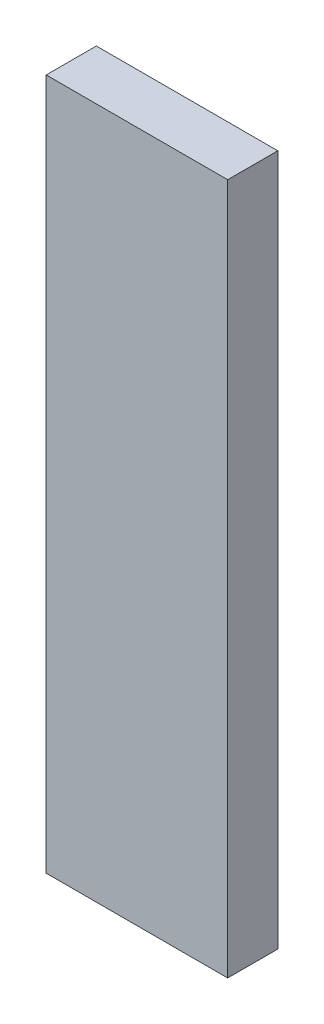
ISO-10303-21;
HEADER;
FILE_DESCRIPTION(('STEP AP214'),'2;1');
FILE_NAME('part.step','',(''),(''),'','','');
FILE_SCHEMA(('AUTOMOTIVE_DESIGN { 1 0 10303 214 1 1 1 1 }'));
ENDSEC;
DATA;
#1=APPLICATION_CONTEXT('core data for automotive mechanical design processes');
#2=APPLICATION_PROTOCOL_DEFINITION('international standard','automotive_design',2000,#1);
#3=PRODUCT_CONTEXT('',#1,'mechanical');
#4=PRODUCT('Part','Part','',(#3));
#5=PRODUCT_RELATED_PRODUCT_CATEGORY('part','',(#4));
#6=PRODUCT_DEFINITION_FORMATION('','',#4);
#7=PRODUCT_DEFINITION_CONTEXT('part definition',#1,'design');
#8=PRODUCT_DEFINITION('design','',#6,#7);
#9=PRODUCT_DEFINITION_SHAPE('','',#8);
#10=(LENGTH_UNIT() NAMED_UNIT(*) SI_UNIT(.MILLI.,.METRE.));
#11=(NAMED_UNIT(*) PLANE_ANGLE_UNIT() SI_UNIT($,.RADIAN.));
#12=(NAMED_UNIT(*) SI_UNIT($,.STERADIAN.) SOLID_ANGLE_UNIT());
#13=UNCERTAINTY_MEASURE_WITH_UNIT(LENGTH_MEASURE(1.E-05),#10,'distance_accuracy_value','');
#14=(GEOMETRIC_REPRESENTATION_CONTEXT(3) GLOBAL_UNCERTAINTY_ASSIGNED_CONTEXT((#13)) GLOBAL_UNIT_ASSIGNED_CONTEXT((#10,
#11,#12)) REPRESENTATION_CONTEXT('',''));
#15=CARTESIAN_POINT('',(0.,0.,0.));
#16=DIRECTION('',(0.,0.,1.));
#17=DIRECTION('',(1.,0.,0.));
#18=AXIS2_PLACEMENT_3D('',#15,#16,#17);
#19=CARTESIAN_POINT('',(5.25,40.,1.45));
#20=DIRECTION('',(-1.,0.,0.));
#21=DIRECTION('',(0.,0.,1.));
#22=AXIS2_PLACEMENT_3D('',#19,#20,#21);
#23=PLANE('',#22);
#24=DIRECTION('',(0.,0.,-1.));
#25=VECTOR('',#24,1.);
#26=CARTESIAN_POINT('',(5.25,0.,1.45));
#27=LINE('',#26,#25);
#28=CARTESIAN_POINT('',(5.25,0.,1.45));
#29=VERTEX_POINT('',#28);
#30=CARTESIAN_POINT('',(5.25,0.,-1.45));
#31=VERTEX_POINT('',#30);
#32=EDGE_CURVE('E96',#29,#31,#27,.T.);
#33=ORIENTED_EDGE('',*,*,#32,.T.);
#34=DIRECTION('',(0.,-1.,0.));
#35=VECTOR('',#34,1.);
#36=CARTESIAN_POINT('',(5.25,40.,-1.45));
#37=LINE('',#36,#35);
#38=CARTESIAN_POINT('',(5.25,40.,-1.45));
#39=VERTEX_POINT('',#38);
#40=EDGE_CURVE('E11',#39,#31,#37,.T.);
#41=ORIENTED_EDGE('',*,*,#40,.F.);
#42=DIRECTION('',(0.,0.,-1.));
#43=VECTOR('',#42,1.);
#44=CARTESIAN_POINT('',(5.25,40.,1.45));
#45=LINE('',#44,#43);
#46=CARTESIAN_POINT('',(5.25,40.,1.45));
#47=VERTEX_POINT('',#46);
#48=EDGE_CURVE('E84',#47,#39,#45,.T.);
#49=ORIENTED_EDGE('',*,*,#48,.F.);
#50=DIRECTION('',(0.,-1.,0.));
#51=VECTOR('',#50,1.);
#52=CARTESIAN_POINT('',(5.25,40.,1.45));
#53=LINE('',#52,#51);
#54=EDGE_CURVE('E92',#47,#29,#53,.T.);
#55=ORIENTED_EDGE('',*,*,#54,.T.);
#56=EDGE_LOOP('',(#33,#41,#49,#55));
#57=FACE_BOUND('',#56,.T.);
#58=ADVANCED_FACE('F33',(#57),#23,.F.);
#59=CARTESIAN_POINT('',(-5.25,40.,-1.45));
#60=DIRECTION('',(0.,0.,1.));
#61=DIRECTION('',(1.,0.,0.));
#62=AXIS2_PLACEMENT_3D('',#59,#60,#61);
#63=PLANE('',#62);
#64=DIRECTION('',(-1.,0.,0.));
#65=VECTOR('',#64,1.);
#66=CARTESIAN_POINT('',(-5.25,0.,-1.45));
#67=LINE('',#66,#65);
#68=CARTESIAN_POINT('',(-5.25,0.,-1.45));
#69=VERTEX_POINT('',#68);
#70=EDGE_CURVE('E88',#31,#69,#67,.T.);
#71=ORIENTED_EDGE('',*,*,#70,.T.);
#72=DIRECTION('',(0.,-1.,0.));
#73=VECTOR('',#72,1.);
#74=CARTESIAN_POINT('',(-5.25,40.,-1.45));
#75=LINE('',#74,#73);
#76=CARTESIAN_POINT('',(-5.25,40.,-1.45));
#77=VERTEX_POINT('',#76);
#78=EDGE_CURVE('E41',#77,#69,#75,.T.);
#79=ORIENTED_EDGE('',*,*,#78,.F.);
#80=DIRECTION('',(-1.,0.,0.));
#81=VECTOR('',#80,1.);
#82=CARTESIAN_POINT('',(-5.25,40.,-1.45));
#83=LINE('',#82,#81);
#84=EDGE_CURVE('E79',#39,#77,#83,.T.);
#85=ORIENTED_EDGE('',*,*,#84,.F.);
#86=ORIENTED_EDGE('',*,*,#40,.T.);
#87=EDGE_LOOP('',(#71,#79,#85,#86));
#88=FACE_BOUND('',#87,.T.);
#89=ADVANCED_FACE('F87',(#88),#63,.F.);
#90=CARTESIAN_POINT('',(-5.25,40.,1.45));
#91=DIRECTION('',(1.,0.,0.));
#92=DIRECTION('',(0.,0.,-1.));
#93=AXIS2_PLACEMENT_3D('',#90,#91,#92);
#94=PLANE('',#93);
#95=DIRECTION('',(0.,0.,1.));
#96=VECTOR('',#95,1.);
#97=CARTESIAN_POINT('',(-5.25,0.,1.45));
#98=LINE('',#97,#96);
#99=CARTESIAN_POINT('',(-5.25,0.,1.45));
#100=VERTEX_POINT('',#99);
#101=EDGE_CURVE('E66',#69,#100,#98,.T.);
#102=ORIENTED_EDGE('',*,*,#101,.T.);
#103=DIRECTION('',(0.,-1.,0.));
#104=VECTOR('',#103,1.);
#105=CARTESIAN_POINT('',(-5.25,40.,1.45));
#106=LINE('',#105,#104);
#107=CARTESIAN_POINT('',(-5.25,40.,1.45));
#108=VERTEX_POINT('',#107);
#109=EDGE_CURVE('E89',#108,#100,#106,.T.);
#110=ORIENTED_EDGE('',*,*,#109,.F.);
#111=DIRECTION('',(0.,0.,1.));
#112=VECTOR('',#111,1.);
#113=CARTESIAN_POINT('',(-5.25,40.,1.45));
#114=LINE('',#113,#112);
#115=EDGE_CURVE('E82',#77,#108,#114,.T.);
#116=ORIENTED_EDGE('',*,*,#115,.F.);
#117=ORIENTED_EDGE('',*,*,#78,.T.);
#118=EDGE_LOOP('',(#102,#110,#116,#117));
#119=FACE_BOUND('',#118,.T.);
#120=ADVANCED_FACE('F90',(#119),#94,.F.);
#121=CARTESIAN_POINT('',(-5.25,40.,1.45));
#122=DIRECTION('',(0.,0.,-1.));
#123=DIRECTION('',(-1.,0.,0.));
#124=AXIS2_PLACEMENT_3D('',#121,#122,#123);
#125=PLANE('',#124);
#126=DIRECTION('',(1.,0.,0.));
#127=VECTOR('',#126,1.);
#128=CARTESIAN_POINT('',(-5.25,0.,1.45));
#129=LINE('',#128,#127);
#130=EDGE_CURVE('E72',#100,#29,#129,.T.);
#131=ORIENTED_EDGE('',*,*,#130,.T.);
#132=ORIENTED_EDGE('',*,*,#54,.F.);
#133=DIRECTION('',(1.,0.,0.));
#134=VECTOR('',#133,1.);
#135=CARTESIAN_POINT('',(-5.25,40.,1.45));
#136=LINE('',#135,#134);
#137=EDGE_CURVE('E49',#108,#47,#136,.T.);
#138=ORIENTED_EDGE('',*,*,#137,.F.);
#139=ORIENTED_EDGE('',*,*,#109,.T.);
#140=EDGE_LOOP('',(#131,#132,#138,#139));
#141=FACE_BOUND('',#140,.T.);
#142=ADVANCED_FACE('F103',(#141),#125,.F.);
#143=CARTESIAN_POINT('',(0.,40.,0.));
#144=DIRECTION('',(0.,-1.,0.));
#145=DIRECTION('',(0.,0.,-1.));
#146=AXIS2_PLACEMENT_3D('',#143,#144,#145);
#147=PLANE('',#146);
#148=ORIENTED_EDGE('',*,*,#48,.T.);
#149=ORIENTED_EDGE('',*,*,#84,.T.);
#150=ORIENTED_EDGE('',*,*,#115,.T.);
#151=ORIENTED_EDGE('',*,*,#137,.T.);
#152=EDGE_LOOP('',(#148,#149,#150,#151));
#153=FACE_BOUND('',#152,.T.);
#154=ADVANCED_FACE('F80',(#153),#147,.F.);
#155=CARTESIAN_POINT('',(0.,0.,0.));
#156=DIRECTION('',(0.,-1.,0.));
#157=DIRECTION('',(0.,0.,-1.));
#158=AXIS2_PLACEMENT_3D('',#155,#156,#157);
#159=PLANE('',#158);
#160=ORIENTED_EDGE('',*,*,#32,.F.);
#161=ORIENTED_EDGE('',*,*,#130,.F.);
#162=ORIENTED_EDGE('',*,*,#101,.F.);
#163=ORIENTED_EDGE('',*,*,#70,.F.);
#164=EDGE_LOOP('',(#160,#161,#162,#163));
#165=FACE_BOUND('',#164,.T.);
#166=ADVANCED_FACE('F106',(#165),#159,.T.);
#167=CLOSED_SHELL('',(#58,#89,#120,#142,#154,#166));
#168=MANIFOLD_SOLID_BREP('B2',#167);
#169=ADVANCED_BREP_SHAPE_REPRESENTATION('',(#18,#168),#14);
#170=SHAPE_DEFINITION_REPRESENTATION(#9,#169);
ENDSEC;
END-ISO-10303-21;
